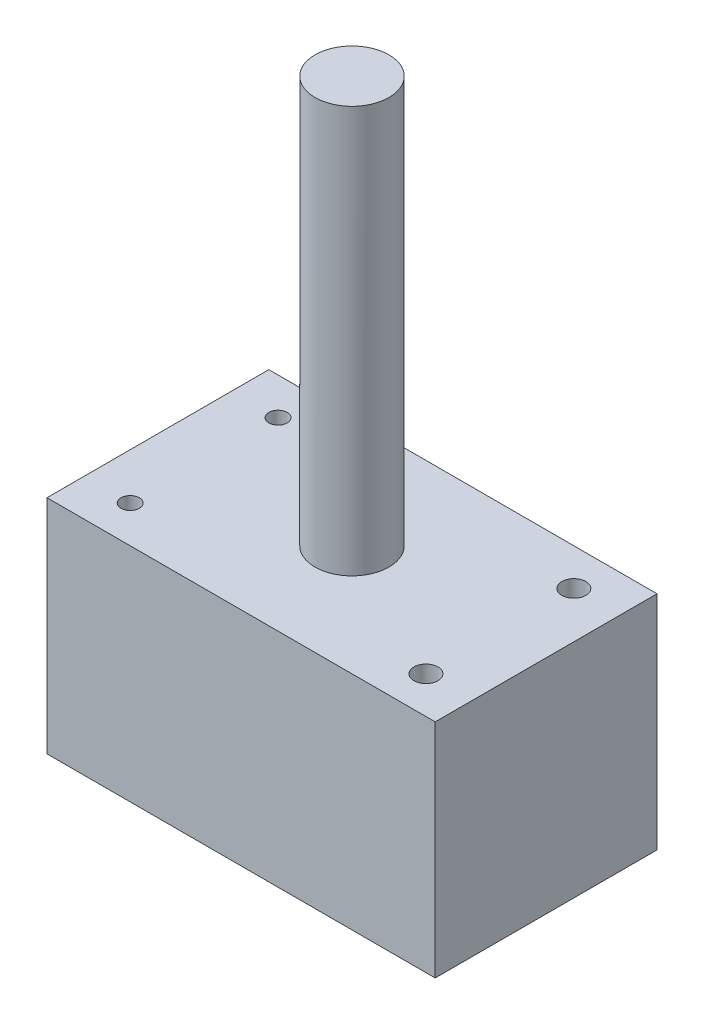
ISO-10303-21;
HEADER;
FILE_DESCRIPTION(('STEP AP214'),'2;1');
FILE_NAME('part.step','',(''),(''),'','','');
FILE_SCHEMA(('AUTOMOTIVE_DESIGN { 1 0 10303 214 1 1 1 1 }'));
ENDSEC;
DATA;
#1=APPLICATION_CONTEXT('core data for automotive mechanical design processes');
#2=APPLICATION_PROTOCOL_DEFINITION('international standard','automotive_design',2000,#1);
#3=PRODUCT_CONTEXT('',#1,'mechanical');
#4=PRODUCT('Part','Part','',(#3));
#5=PRODUCT_RELATED_PRODUCT_CATEGORY('part','',(#4));
#6=PRODUCT_DEFINITION_FORMATION('','',#4);
#7=PRODUCT_DEFINITION_CONTEXT('part definition',#1,'design');
#8=PRODUCT_DEFINITION('design','',#6,#7);
#9=PRODUCT_DEFINITION_SHAPE('','',#8);
#10=(LENGTH_UNIT() NAMED_UNIT(*) SI_UNIT(.MILLI.,.METRE.));
#11=(NAMED_UNIT(*) PLANE_ANGLE_UNIT() SI_UNIT($,.RADIAN.));
#12=(NAMED_UNIT(*) SI_UNIT($,.STERADIAN.) SOLID_ANGLE_UNIT());
#13=UNCERTAINTY_MEASURE_WITH_UNIT(LENGTH_MEASURE(1.E-05),#10,'distance_accuracy_value','');
#14=(GEOMETRIC_REPRESENTATION_CONTEXT(3) GLOBAL_UNCERTAINTY_ASSIGNED_CONTEXT((#13)) GLOBAL_UNIT_ASSIGNED_CONTEXT((#10,
#11,#12)) REPRESENTATION_CONTEXT('',''));
#15=CARTESIAN_POINT('',(0.,0.,0.));
#16=DIRECTION('',(0.,0.,1.));
#17=DIRECTION('',(1.,0.,0.));
#18=AXIS2_PLACEMENT_3D('',#15,#16,#17);
#19=CARTESIAN_POINT('',(0.,60.,0.));
#20=DIRECTION('',(0.,-1.,0.));
#21=DIRECTION('',(0.,0.,-1.));
#22=AXIS2_PLACEMENT_3D('',#19,#20,#21);
#23=PLANE('',#22);
#24=CARTESIAN_POINT('',(0.,60.,0.));
#25=DIRECTION('',(0.,-1.,0.));
#26=DIRECTION('',(0.,0.,-1.));
#27=AXIS2_PLACEMENT_3D('',#24,#25,#26);
#28=CIRCLE('',#27,10.);
#29=CARTESIAN_POINT('',(0.,60.,-10.));
#30=VERTEX_POINT('',#29);
#31=EDGE_CURVE('E11',#30,#30,#28,.F.);
#32=ORIENTED_EDGE('',*,*,#31,.F.);
#33=EDGE_LOOP('',(#32));
#34=FACE_BOUND('',#33,.T.);
#35=DIRECTION('',(0.,0.,-1.));
#36=VECTOR('',#35,1.);
#37=CARTESIAN_POINT('',(52.5,60.,30.));
#38=LINE('',#37,#36);
#39=CARTESIAN_POINT('',(52.5,60.,30.));
#40=VERTEX_POINT('',#39);
#41=CARTESIAN_POINT('',(52.5,60.,-30.));
#42=VERTEX_POINT('',#41);
#43=EDGE_CURVE('E93',#40,#42,#38,.T.);
#44=ORIENTED_EDGE('',*,*,#43,.T.);
#45=DIRECTION('',(-1.,0.,0.));
#46=VECTOR('',#45,1.);
#47=CARTESIAN_POINT('',(-52.5,60.,-30.));
#48=LINE('',#47,#46);
#49=CARTESIAN_POINT('',(-52.5,60.,-30.));
#50=VERTEX_POINT('',#49);
#51=EDGE_CURVE('E88',#42,#50,#48,.T.);
#52=ORIENTED_EDGE('',*,*,#51,.T.);
#53=DIRECTION('',(0.,0.,1.));
#54=VECTOR('',#53,1.);
#55=CARTESIAN_POINT('',(-52.5,60.,30.));
#56=LINE('',#55,#54);
#57=CARTESIAN_POINT('',(-52.5,60.,30.));
#58=VERTEX_POINT('',#57);
#59=EDGE_CURVE('E91',#50,#58,#56,.T.);
#60=ORIENTED_EDGE('',*,*,#59,.T.);
#61=DIRECTION('',(1.,0.,0.));
#62=VECTOR('',#61,1.);
#63=CARTESIAN_POINT('',(-52.5,60.,30.));
#64=LINE('',#63,#62);
#65=EDGE_CURVE('E57',#58,#40,#64,.T.);
#66=ORIENTED_EDGE('',*,*,#65,.T.);
#67=EDGE_LOOP('',(#44,#52,#60,#66));
#68=FACE_BOUND('',#67,.T.);
#69=CARTESIAN_POINT('',(-40.,60.,20.));
#70=DIRECTION('',(0.,1.,0.));
#71=DIRECTION('',(0.,0.,1.));
#72=AXIS2_PLACEMENT_3D('',#69,#70,#71);
#73=CIRCLE('',#72,2.48069469178417);
#74=CARTESIAN_POINT('',(-40.,60.,22.4806946917842));
#75=VERTEX_POINT('',#74);
#76=EDGE_CURVE('E109',#75,#75,#73,.T.);
#77=ORIENTED_EDGE('',*,*,#76,.F.);
#78=EDGE_LOOP('',(#77));
#79=FACE_BOUND('',#78,.T.);
#80=CARTESIAN_POINT('',(40.,60.,20.));
#81=DIRECTION('',(0.,1.,0.));
#82=DIRECTION('',(0.,0.,1.));
#83=AXIS2_PLACEMENT_3D('',#80,#81,#82);
#84=CIRCLE('',#83,3.25);
#85=CARTESIAN_POINT('',(40.,60.,23.25));
#86=VERTEX_POINT('',#85);
#87=EDGE_CURVE('E124',#86,#86,#84,.T.);
#88=ORIENTED_EDGE('',*,*,#87,.F.);
#89=EDGE_LOOP('',(#88));
#90=FACE_BOUND('',#89,.T.);
#91=CARTESIAN_POINT('',(-40.,60.,-20.));
#92=DIRECTION('',(0.,1.,0.));
#93=DIRECTION('',(0.,0.,1.));
#94=AXIS2_PLACEMENT_3D('',#91,#92,#93);
#95=CIRCLE('',#94,2.48069469178417);
#96=CARTESIAN_POINT('',(-40.,60.,-17.5193053082158));
#97=VERTEX_POINT('',#96);
#98=EDGE_CURVE('E130',#97,#97,#95,.T.);
#99=ORIENTED_EDGE('',*,*,#98,.F.);
#100=EDGE_LOOP('',(#99));
#101=FACE_BOUND('',#100,.T.);
#102=CARTESIAN_POINT('',(40.,60.,-20.));
#103=DIRECTION('',(0.,1.,0.));
#104=DIRECTION('',(0.,0.,1.));
#105=AXIS2_PLACEMENT_3D('',#102,#103,#104);
#106=CIRCLE('',#105,3.25);
#107=CARTESIAN_POINT('',(40.,60.,-16.75));
#108=VERTEX_POINT('',#107);
#109=EDGE_CURVE('E136',#108,#108,#106,.T.);
#110=ORIENTED_EDGE('',*,*,#109,.F.);
#111=EDGE_LOOP('',(#110));
#112=FACE_BOUND('',#111,.T.);
#113=ADVANCED_FACE('F39',(#34,#68,#79,#90,#101,#112),#23,.F.);
#114=CARTESIAN_POINT('',(0.,0.,0.));
#115=DIRECTION('',(0.,-1.,0.));
#116=DIRECTION('',(0.,0.,-1.));
#117=AXIS2_PLACEMENT_3D('',#114,#115,#116);
#118=PLANE('',#117);
#119=CARTESIAN_POINT('',(-40.,0.,-20.));
#120=DIRECTION('',(0.,1.,0.));
#121=DIRECTION('',(0.,0.,1.));
#122=AXIS2_PLACEMENT_3D('',#119,#120,#121);
#123=CIRCLE('',#122,2.48069469178417);
#124=CARTESIAN_POINT('',(-40.,0.,-17.5193053082158));
#125=VERTEX_POINT('',#124);
#126=EDGE_CURVE('E133',#125,#125,#123,.T.);
#127=ORIENTED_EDGE('',*,*,#126,.T.);
#128=EDGE_LOOP('',(#127));
#129=FACE_BOUND('',#128,.T.);
#130=CARTESIAN_POINT('',(-40.,0.,20.));
#131=DIRECTION('',(0.,1.,0.));
#132=DIRECTION('',(0.,0.,1.));
#133=AXIS2_PLACEMENT_3D('',#130,#131,#132);
#134=CIRCLE('',#133,2.48069469178417);
#135=CARTESIAN_POINT('',(-40.,0.,22.4806946917842));
#136=VERTEX_POINT('',#135);
#137=EDGE_CURVE('E121',#136,#136,#134,.T.);
#138=ORIENTED_EDGE('',*,*,#137,.T.);
#139=EDGE_LOOP('',(#138));
#140=FACE_BOUND('',#139,.T.);
#141=DIRECTION('',(0.,0.,-1.));
#142=VECTOR('',#141,1.);
#143=CARTESIAN_POINT('',(52.5,0.,30.));
#144=LINE('',#143,#142);
#145=CARTESIAN_POINT('',(52.5,0.,30.));
#146=VERTEX_POINT('',#145);
#147=CARTESIAN_POINT('',(52.5,0.,-30.));
#148=VERTEX_POINT('',#147);
#149=EDGE_CURVE('E106',#146,#148,#144,.T.);
#150=ORIENTED_EDGE('',*,*,#149,.F.);
#151=DIRECTION('',(1.,0.,0.));
#152=VECTOR('',#151,1.);
#153=CARTESIAN_POINT('',(-52.5,0.,30.));
#154=LINE('',#153,#152);
#155=CARTESIAN_POINT('',(-52.5,0.,30.));
#156=VERTEX_POINT('',#155);
#157=EDGE_CURVE('E80',#156,#146,#154,.T.);
#158=ORIENTED_EDGE('',*,*,#157,.F.);
#159=DIRECTION('',(0.,0.,1.));
#160=VECTOR('',#159,1.);
#161=CARTESIAN_POINT('',(-52.5,0.,30.));
#162=LINE('',#161,#160);
#163=CARTESIAN_POINT('',(-52.5,0.,-30.));
#164=VERTEX_POINT('',#163);
#165=EDGE_CURVE('E74',#164,#156,#162,.T.);
#166=ORIENTED_EDGE('',*,*,#165,.F.);
#167=DIRECTION('',(-1.,0.,0.));
#168=VECTOR('',#167,1.);
#169=CARTESIAN_POINT('',(-52.5,0.,-30.));
#170=LINE('',#169,#168);
#171=EDGE_CURVE('E98',#148,#164,#170,.T.);
#172=ORIENTED_EDGE('',*,*,#171,.F.);
#173=EDGE_LOOP('',(#150,#158,#166,#172));
#174=FACE_BOUND('',#173,.T.);
#175=CARTESIAN_POINT('',(40.,0.,20.));
#176=DIRECTION('',(0.,1.,0.));
#177=DIRECTION('',(0.,0.,1.));
#178=AXIS2_PLACEMENT_3D('',#175,#176,#177);
#179=CIRCLE('',#178,3.25);
#180=CARTESIAN_POINT('',(40.,0.,23.25));
#181=VERTEX_POINT('',#180);
#182=EDGE_CURVE('E127',#181,#181,#179,.T.);
#183=ORIENTED_EDGE('',*,*,#182,.T.);
#184=EDGE_LOOP('',(#183));
#185=FACE_BOUND('',#184,.T.);
#186=CARTESIAN_POINT('',(40.,0.,-20.));
#187=DIRECTION('',(0.,1.,0.));
#188=DIRECTION('',(0.,0.,1.));
#189=AXIS2_PLACEMENT_3D('',#186,#187,#188);
#190=CIRCLE('',#189,3.25);
#191=CARTESIAN_POINT('',(40.,0.,-16.75));
#192=VERTEX_POINT('',#191);
#193=EDGE_CURVE('E139',#192,#192,#190,.T.);
#194=ORIENTED_EDGE('',*,*,#193,.T.);
#195=EDGE_LOOP('',(#194));
#196=FACE_BOUND('',#195,.T.);
#197=ADVANCED_FACE('F117',(#129,#140,#174,#185,#196),#118,.T.);
#198=CARTESIAN_POINT('',(52.5,60.,30.));
#199=DIRECTION('',(-1.,0.,0.));
#200=DIRECTION('',(0.,0.,1.));
#201=AXIS2_PLACEMENT_3D('',#198,#199,#200);
#202=PLANE('',#201);
#203=ORIENTED_EDGE('',*,*,#149,.T.);
#204=DIRECTION('',(0.,-1.,0.));
#205=VECTOR('',#204,1.);
#206=CARTESIAN_POINT('',(52.5,60.,-30.));
#207=LINE('',#206,#205);
#208=EDGE_CURVE('E43',#42,#148,#207,.T.);
#209=ORIENTED_EDGE('',*,*,#208,.F.);
#210=ORIENTED_EDGE('',*,*,#43,.F.);
#211=DIRECTION('',(0.,-1.,0.));
#212=VECTOR('',#211,1.);
#213=CARTESIAN_POINT('',(52.5,60.,30.));
#214=LINE('',#213,#212);
#215=EDGE_CURVE('E102',#40,#146,#214,.T.);
#216=ORIENTED_EDGE('',*,*,#215,.T.);
#217=EDGE_LOOP('',(#203,#209,#210,#216));
#218=FACE_BOUND('',#217,.T.);
#219=ADVANCED_FACE('F41',(#218),#202,.F.);
#220=CARTESIAN_POINT('',(-52.5,60.,-30.));
#221=DIRECTION('',(0.,0.,1.));
#222=DIRECTION('',(1.,0.,0.));
#223=AXIS2_PLACEMENT_3D('',#220,#221,#222);
#224=PLANE('',#223);
#225=ORIENTED_EDGE('',*,*,#171,.T.);
#226=DIRECTION('',(0.,-1.,0.));
#227=VECTOR('',#226,1.);
#228=CARTESIAN_POINT('',(-52.5,60.,-30.));
#229=LINE('',#228,#227);
#230=EDGE_CURVE('E96',#50,#164,#229,.T.);
#231=ORIENTED_EDGE('',*,*,#230,.F.);
#232=ORIENTED_EDGE('',*,*,#51,.F.);
#233=ORIENTED_EDGE('',*,*,#208,.T.);
#234=EDGE_LOOP('',(#225,#231,#232,#233));
#235=FACE_BOUND('',#234,.T.);
#236=ADVANCED_FACE('F97',(#235),#224,.F.);
#237=CARTESIAN_POINT('',(-52.5,60.,30.));
#238=DIRECTION('',(1.,0.,0.));
#239=DIRECTION('',(0.,0.,-1.));
#240=AXIS2_PLACEMENT_3D('',#237,#238,#239);
#241=PLANE('',#240);
#242=ORIENTED_EDGE('',*,*,#165,.T.);
#243=DIRECTION('',(0.,-1.,0.));
#244=VECTOR('',#243,1.);
#245=CARTESIAN_POINT('',(-52.5,60.,30.));
#246=LINE('',#245,#244);
#247=EDGE_CURVE('E99',#58,#156,#246,.T.);
#248=ORIENTED_EDGE('',*,*,#247,.F.);
#249=ORIENTED_EDGE('',*,*,#59,.F.);
#250=ORIENTED_EDGE('',*,*,#230,.T.);
#251=EDGE_LOOP('',(#242,#248,#249,#250));
#252=FACE_BOUND('',#251,.T.);
#253=ADVANCED_FACE('F100',(#252),#241,.F.);
#254=CARTESIAN_POINT('',(-52.5,60.,30.));
#255=DIRECTION('',(0.,0.,-1.));
#256=DIRECTION('',(-1.,0.,0.));
#257=AXIS2_PLACEMENT_3D('',#254,#255,#256);
#258=PLANE('',#257);
#259=ORIENTED_EDGE('',*,*,#157,.T.);
#260=ORIENTED_EDGE('',*,*,#215,.F.);
#261=ORIENTED_EDGE('',*,*,#65,.F.);
#262=ORIENTED_EDGE('',*,*,#247,.T.);
#263=EDGE_LOOP('',(#259,#260,#261,#262));
#264=FACE_BOUND('',#263,.T.);
#265=ADVANCED_FACE('F114',(#264),#258,.F.);
#266=CARTESIAN_POINT('',(-40.,60.,20.));
#267=DIRECTION('',(0.,-1.,0.));
#268=DIRECTION('',(0.,0.,-1.));
#269=AXIS2_PLACEMENT_3D('',#266,#267,#268);
#270=CYLINDRICAL_SURFACE('',#269,2.48069469178417);
#271=ORIENTED_EDGE('',*,*,#76,.T.);
#272=EDGE_LOOP('',(#271));
#273=FACE_BOUND('',#272,.T.);
#274=ORIENTED_EDGE('',*,*,#137,.F.);
#275=EDGE_LOOP('',(#274));
#276=FACE_BOUND('',#275,.T.);
#277=ADVANCED_FACE('F165',(#273,#276),#270,.F.);
#278=CARTESIAN_POINT('',(40.,60.,20.));
#279=DIRECTION('',(0.,-1.,0.));
#280=DIRECTION('',(0.,0.,-1.));
#281=AXIS2_PLACEMENT_3D('',#278,#279,#280);
#282=CYLINDRICAL_SURFACE('',#281,3.25);
#283=ORIENTED_EDGE('',*,*,#87,.T.);
#284=EDGE_LOOP('',(#283));
#285=FACE_BOUND('',#284,.T.);
#286=ORIENTED_EDGE('',*,*,#182,.F.);
#287=EDGE_LOOP('',(#286));
#288=FACE_BOUND('',#287,.T.);
#289=ADVANCED_FACE('F221',(#285,#288),#282,.F.);
#290=CARTESIAN_POINT('',(-40.,60.,-20.));
#291=DIRECTION('',(0.,-1.,0.));
#292=DIRECTION('',(0.,0.,-1.));
#293=AXIS2_PLACEMENT_3D('',#290,#291,#292);
#294=CYLINDRICAL_SURFACE('',#293,2.48069469178417);
#295=ORIENTED_EDGE('',*,*,#98,.T.);
#296=EDGE_LOOP('',(#295));
#297=FACE_BOUND('',#296,.T.);
#298=ORIENTED_EDGE('',*,*,#126,.F.);
#299=EDGE_LOOP('',(#298));
#300=FACE_BOUND('',#299,.T.);
#301=ADVANCED_FACE('F212',(#297,#300),#294,.F.);
#302=CARTESIAN_POINT('',(40.,60.,-20.));
#303=DIRECTION('',(0.,-1.,0.));
#304=DIRECTION('',(0.,0.,-1.));
#305=AXIS2_PLACEMENT_3D('',#302,#303,#304);
#306=CYLINDRICAL_SURFACE('',#305,3.25);
#307=ORIENTED_EDGE('',*,*,#109,.T.);
#308=EDGE_LOOP('',(#307));
#309=FACE_BOUND('',#308,.T.);
#310=ORIENTED_EDGE('',*,*,#193,.F.);
#311=EDGE_LOOP('',(#310));
#312=FACE_BOUND('',#311,.T.);
#313=ADVANCED_FACE('F153',(#309,#312),#306,.F.);
#314=CARTESIAN_POINT('',(0.,170.,0.));
#315=DIRECTION('',(0.,-1.,0.));
#316=DIRECTION('',(0.,0.,-1.));
#317=AXIS2_PLACEMENT_3D('',#314,#315,#316);
#318=CYLINDRICAL_SURFACE('',#317,10.);
#319=CARTESIAN_POINT('',(0.,170.,0.));
#320=DIRECTION('',(0.,1.,0.));
#321=DIRECTION('',(0.,0.,1.));
#322=AXIS2_PLACEMENT_3D('',#319,#320,#321);
#323=CIRCLE('',#322,10.);
#324=CARTESIAN_POINT('',(0.,170.,10.));
#325=VERTEX_POINT('',#324);
#326=EDGE_CURVE('E142',#325,#325,#323,.T.);
#327=ORIENTED_EDGE('',*,*,#326,.F.);
#328=EDGE_LOOP('',(#327));
#329=FACE_BOUND('',#328,.T.);
#330=ORIENTED_EDGE('',*,*,#31,.T.);
#331=EDGE_LOOP('',(#330));
#332=FACE_BOUND('',#331,.T.);
#333=ADVANCED_FACE('F150',(#329,#332),#318,.T.);
#334=CARTESIAN_POINT('',(0.,170.,0.));
#335=DIRECTION('',(0.,1.,0.));
#336=DIRECTION('',(0.,0.,1.));
#337=AXIS2_PLACEMENT_3D('',#334,#335,#336);
#338=PLANE('',#337);
#339=ORIENTED_EDGE('',*,*,#326,.T.);
#340=EDGE_LOOP('',(#339));
#341=FACE_BOUND('',#340,.T.);
#342=ADVANCED_FACE('F148',(#341),#338,.T.);
#343=CLOSED_SHELL('',(#113,#197,#219,#236,#253,#265,#277,#289,#301,#313,#333,#342));
#344=MANIFOLD_SOLID_BREP('B2',#343);
#345=ADVANCED_BREP_SHAPE_REPRESENTATION('',(#18,#344),#14);
#346=SHAPE_DEFINITION_REPRESENTATION(#9,#345);
ENDSEC;
END-ISO-10303-21;
